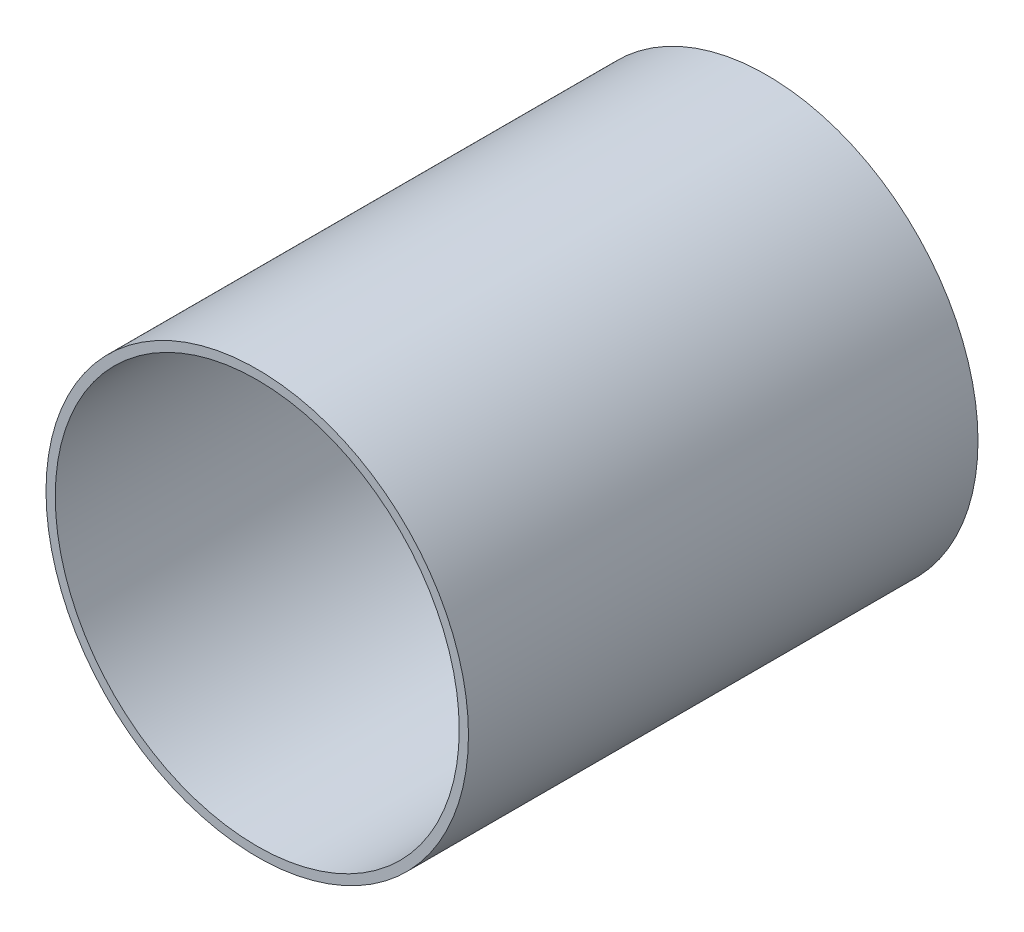
ISO-10303-21;
HEADER;
FILE_DESCRIPTION(('STEP AP214'),'2;1');
FILE_NAME('part.step','',(''),(''),'','','');
FILE_SCHEMA(('AUTOMOTIVE_DESIGN { 1 0 10303 214 1 1 1 1 }'));
ENDSEC;
DATA;
#1=APPLICATION_CONTEXT('core data for automotive mechanical design processes');
#2=APPLICATION_PROTOCOL_DEFINITION('international standard','automotive_design',2000,#1);
#3=PRODUCT_CONTEXT('',#1,'mechanical');
#4=PRODUCT('Part','Part','',(#3));
#5=PRODUCT_RELATED_PRODUCT_CATEGORY('part','',(#4));
#6=PRODUCT_DEFINITION_FORMATION('','',#4);
#7=PRODUCT_DEFINITION_CONTEXT('part definition',#1,'design');
#8=PRODUCT_DEFINITION('design','',#6,#7);
#9=PRODUCT_DEFINITION_SHAPE('','',#8);
#10=(LENGTH_UNIT() NAMED_UNIT(*) SI_UNIT(.MILLI.,.METRE.));
#11=(NAMED_UNIT(*) PLANE_ANGLE_UNIT() SI_UNIT($,.RADIAN.));
#12=(NAMED_UNIT(*) SI_UNIT($,.STERADIAN.) SOLID_ANGLE_UNIT());
#13=UNCERTAINTY_MEASURE_WITH_UNIT(LENGTH_MEASURE(1.E-05),#10,'distance_accuracy_value','');
#14=(GEOMETRIC_REPRESENTATION_CONTEXT(3) GLOBAL_UNCERTAINTY_ASSIGNED_CONTEXT((#13)) GLOBAL_UNIT_ASSIGNED_CONTEXT((#10,
#11,#12)) REPRESENTATION_CONTEXT('',''));
#15=CARTESIAN_POINT('',(0.,0.,0.));
#16=DIRECTION('',(0.,0.,1.));
#17=DIRECTION('',(1.,0.,0.));
#18=AXIS2_PLACEMENT_3D('',#15,#16,#17);
#19=CARTESIAN_POINT('',(0.,0.,0.));
#20=DIRECTION('',(0.,0.,-1.));
#21=DIRECTION('',(1.,0.,0.));
#22=AXIS2_PLACEMENT_3D('',#19,#20,#21);
#23=CYLINDRICAL_SURFACE('',#22,0.58040016);
#24=CARTESIAN_POINT('',(0.,0.,1.39999974));
#25=DIRECTION('',(0.,0.,1.));
#26=DIRECTION('',(1.,0.,0.));
#27=AXIS2_PLACEMENT_3D('',#24,#25,#26);
#28=CIRCLE('',#27,0.58040016);
#29=CARTESIAN_POINT('',(0.58040016,0.,1.39999974));
#30=VERTEX_POINT('',#29);
#31=EDGE_CURVE('E11',#30,#30,#28,.T.);
#32=ORIENTED_EDGE('',*,*,#31,.F.);
#33=DIRECTION('',(0.,0.,1.));
#34=VECTOR('',#33,1.);
#35=CARTESIAN_POINT('',(0.58040016,0.,0.));
#36=LINE('',#35,#34);
#37=CARTESIAN_POINT('',(0.58040016,0.,0.));
#38=VERTEX_POINT('',#37);
#39=EDGE_CURVE('E24',#38,#30,#36,.T.);
#40=ORIENTED_EDGE('',*,*,#39,.F.);
#41=CARTESIAN_POINT('',(0.,0.,0.));
#42=DIRECTION('',(0.,0.,1.));
#43=DIRECTION('',(1.,0.,0.));
#44=AXIS2_PLACEMENT_3D('',#41,#42,#43);
#45=CIRCLE('',#44,0.58040016);
#46=EDGE_CURVE('E46',#38,#38,#45,.T.);
#47=ORIENTED_EDGE('',*,*,#46,.T.);
#48=ORIENTED_EDGE('',*,*,#39,.T.);
#49=EDGE_LOOP('',(#32,#40,#47,#48));
#50=FACE_BOUND('',#49,.T.);
#51=ADVANCED_FACE('F17',(#50),#23,.T.);
#52=CARTESIAN_POINT('',(0.,0.,0.));
#53=DIRECTION('',(0.,0.,-1.));
#54=DIRECTION('',(1.,0.,0.));
#55=AXIS2_PLACEMENT_3D('',#52,#53,#54);
#56=CYLINDRICAL_SURFACE('',#55,0.55500016);
#57=DIRECTION('',(0.,0.,1.));
#58=VECTOR('',#57,1.);
#59=CARTESIAN_POINT('',(0.55500016,0.,0.));
#60=LINE('',#59,#58);
#61=CARTESIAN_POINT('',(0.55500016,0.,0.));
#62=VERTEX_POINT('',#61);
#63=CARTESIAN_POINT('',(0.55500016,0.,1.39999974));
#64=VERTEX_POINT('',#63);
#65=EDGE_CURVE('E40',#62,#64,#60,.T.);
#66=ORIENTED_EDGE('',*,*,#65,.T.);
#67=CARTESIAN_POINT('',(0.,0.,1.39999974));
#68=DIRECTION('',(0.,0.,1.));
#69=DIRECTION('',(1.,0.,0.));
#70=AXIS2_PLACEMENT_3D('',#67,#68,#69);
#71=CIRCLE('',#70,0.55500016);
#72=EDGE_CURVE('E45',#64,#64,#71,.T.);
#73=ORIENTED_EDGE('',*,*,#72,.T.);
#74=ORIENTED_EDGE('',*,*,#65,.F.);
#75=CARTESIAN_POINT('',(0.,0.,0.));
#76=DIRECTION('',(0.,0.,1.));
#77=DIRECTION('',(1.,0.,0.));
#78=AXIS2_PLACEMENT_3D('',#75,#76,#77);
#79=CIRCLE('',#78,0.55500016);
#80=EDGE_CURVE('E43',#62,#62,#79,.T.);
#81=ORIENTED_EDGE('',*,*,#80,.F.);
#82=EDGE_LOOP('',(#66,#73,#74,#81));
#83=FACE_BOUND('',#82,.T.);
#84=ADVANCED_FACE('F42',(#83),#56,.F.);
#85=CARTESIAN_POINT('',(0.58040016,0.,0.));
#86=DIRECTION('',(0.,0.,-1.));
#87=DIRECTION('',(-1.,0.,0.));
#88=AXIS2_PLACEMENT_3D('',#85,#86,#87);
#89=PLANE('',#88);
#90=ORIENTED_EDGE('',*,*,#46,.F.);
#91=EDGE_LOOP('',(#90));
#92=FACE_BOUND('',#91,.T.);
#93=ORIENTED_EDGE('',*,*,#80,.T.);
#94=EDGE_LOOP('',(#93));
#95=FACE_BOUND('',#94,.T.);
#96=ADVANCED_FACE('F49',(#92,#95),#89,.T.);
#97=CARTESIAN_POINT('',(0.58040016,0.,1.39999974));
#98=DIRECTION('',(0.,0.,-1.));
#99=DIRECTION('',(-1.,0.,0.));
#100=AXIS2_PLACEMENT_3D('',#97,#98,#99);
#101=PLANE('',#100);
#102=ORIENTED_EDGE('',*,*,#31,.T.);
#103=EDGE_LOOP('',(#102));
#104=FACE_BOUND('',#103,.T.);
#105=ORIENTED_EDGE('',*,*,#72,.F.);
#106=EDGE_LOOP('',(#105));
#107=FACE_BOUND('',#106,.T.);
#108=ADVANCED_FACE('F56',(#104,#107),#101,.F.);
#109=CLOSED_SHELL('',(#51,#84,#96,#108));
#110=MANIFOLD_SOLID_BREP('B1',#109);
#111=ADVANCED_BREP_SHAPE_REPRESENTATION('',(#18,#110),#14);
#112=SHAPE_DEFINITION_REPRESENTATION(#9,#111);
ENDSEC;
END-ISO-10303-21;
